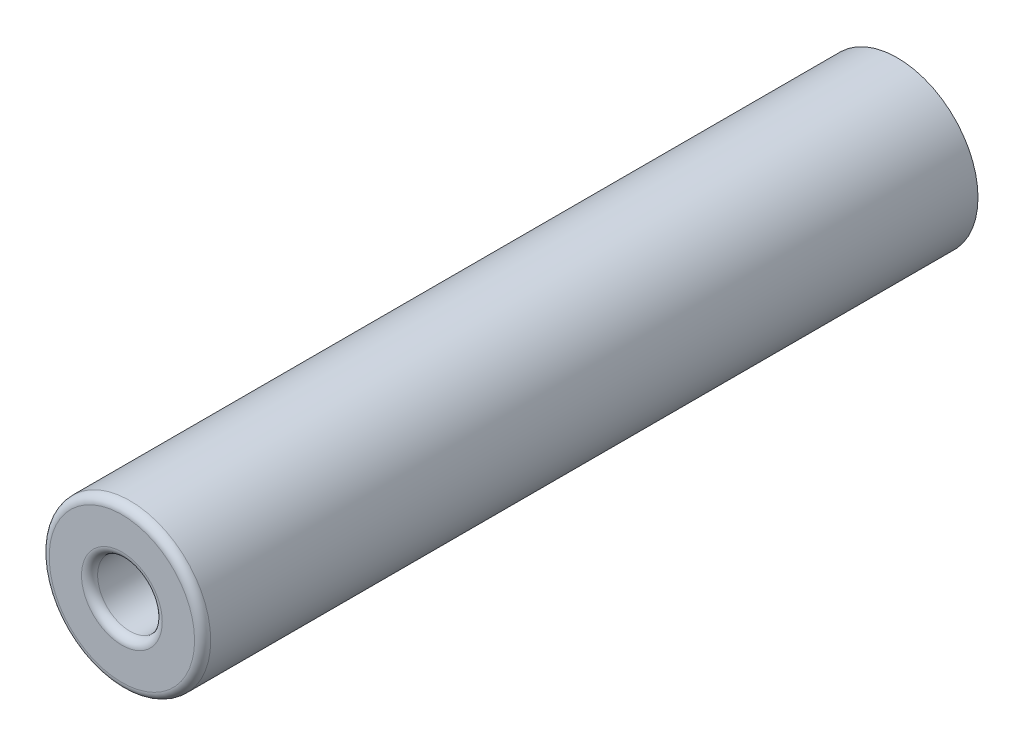
ISO-10303-21;
HEADER;
FILE_DESCRIPTION(('STEP AP214'),'2;1');
FILE_NAME('part.step','',(''),(''),'','','');
FILE_SCHEMA(('AUTOMOTIVE_DESIGN { 1 0 10303 214 1 1 1 1 }'));
ENDSEC;
DATA;
#1=APPLICATION_CONTEXT('core data for automotive mechanical design processes');
#2=APPLICATION_PROTOCOL_DEFINITION('international standard','automotive_design',2000,#1);
#3=PRODUCT_CONTEXT('',#1,'mechanical');
#4=PRODUCT('Part','Part','',(#3));
#5=PRODUCT_RELATED_PRODUCT_CATEGORY('part','',(#4));
#6=PRODUCT_DEFINITION_FORMATION('','',#4);
#7=PRODUCT_DEFINITION_CONTEXT('part definition',#1,'design');
#8=PRODUCT_DEFINITION('design','',#6,#7);
#9=PRODUCT_DEFINITION_SHAPE('','',#8);
#10=(LENGTH_UNIT() NAMED_UNIT(*) SI_UNIT(.MILLI.,.METRE.));
#11=(NAMED_UNIT(*) PLANE_ANGLE_UNIT() SI_UNIT($,.RADIAN.));
#12=(NAMED_UNIT(*) SI_UNIT($,.STERADIAN.) SOLID_ANGLE_UNIT());
#13=UNCERTAINTY_MEASURE_WITH_UNIT(LENGTH_MEASURE(1.E-05),#10,'distance_accuracy_value','');
#14=(GEOMETRIC_REPRESENTATION_CONTEXT(3) GLOBAL_UNCERTAINTY_ASSIGNED_CONTEXT((#13)) GLOBAL_UNIT_ASSIGNED_CONTEXT((#10,
#11,#12)) REPRESENTATION_CONTEXT('',''));
#15=CARTESIAN_POINT('',(0.,0.,0.));
#16=DIRECTION('',(0.,0.,1.));
#17=DIRECTION('',(1.,0.,0.));
#18=AXIS2_PLACEMENT_3D('',#15,#16,#17);
#19=CARTESIAN_POINT('',(0.,0.,24.));
#20=DIRECTION('',(0.,0.,-1.));
#21=DIRECTION('',(-1.,0.,0.));
#22=AXIS2_PLACEMENT_3D('',#19,#20,#21);
#23=CYLINDRICAL_SURFACE('',#22,2.5);
#24=CARTESIAN_POINT('',(0.,0.,23.75));
#25=DIRECTION('',(0.,0.,1.));
#26=DIRECTION('',(1.,0.,0.));
#27=AXIS2_PLACEMENT_3D('',#24,#25,#26);
#28=CIRCLE('',#27,2.5);
#29=CARTESIAN_POINT('',(2.5,0.,23.75));
#30=VERTEX_POINT('',#29);
#31=EDGE_CURVE('E38',#30,#30,#28,.F.);
#32=ORIENTED_EDGE('',*,*,#31,.T.);
#33=EDGE_LOOP('',(#32));
#34=FACE_BOUND('',#33,.T.);
#35=CARTESIAN_POINT('',(0.,0.,0.));
#36=DIRECTION('',(0.,0.,1.));
#37=DIRECTION('',(1.,0.,0.));
#38=AXIS2_PLACEMENT_3D('',#35,#36,#37);
#39=CIRCLE('',#38,2.5);
#40=CARTESIAN_POINT('',(2.5,0.,0.));
#41=VERTEX_POINT('',#40);
#42=EDGE_CURVE('E51',#41,#41,#39,.T.);
#43=ORIENTED_EDGE('',*,*,#42,.T.);
#44=EDGE_LOOP('',(#43));
#45=FACE_BOUND('',#44,.T.);
#46=ADVANCED_FACE('F31',(#34,#45),#23,.T.);
#47=CARTESIAN_POINT('',(0.,0.,24.));
#48=DIRECTION('',(0.,0.,1.));
#49=DIRECTION('',(1.,0.,0.));
#50=AXIS2_PLACEMENT_3D('',#47,#48,#49);
#51=PLANE('',#50);
#52=CARTESIAN_POINT('',(0.,0.,24.));
#53=DIRECTION('',(0.,0.,1.));
#54=DIRECTION('',(1.,0.,0.));
#55=AXIS2_PLACEMENT_3D('',#52,#53,#54);
#56=CIRCLE('',#55,2.25);
#57=CARTESIAN_POINT('',(2.25,0.,24.));
#58=VERTEX_POINT('',#57);
#59=EDGE_CURVE('E42',#58,#58,#56,.T.);
#60=ORIENTED_EDGE('',*,*,#59,.T.);
#61=EDGE_LOOP('',(#60));
#62=FACE_BOUND('',#61,.T.);
#63=CARTESIAN_POINT('',(0.,0.,24.));
#64=DIRECTION('',(0.,0.,1.));
#65=DIRECTION('',(1.,0.,0.));
#66=AXIS2_PLACEMENT_3D('',#63,#64,#65);
#67=CIRCLE('',#66,1.25);
#68=CARTESIAN_POINT('',(1.25,0.,24.));
#69=VERTEX_POINT('',#68);
#70=EDGE_CURVE('E46',#69,#69,#67,.F.);
#71=ORIENTED_EDGE('',*,*,#70,.T.);
#72=EDGE_LOOP('',(#71));
#73=FACE_BOUND('',#72,.T.);
#74=ADVANCED_FACE('F70',(#62,#73),#51,.T.);
#75=CARTESIAN_POINT('',(0.,0.,0.));
#76=DIRECTION('',(0.,0.,1.));
#77=DIRECTION('',(1.,0.,0.));
#78=AXIS2_PLACEMENT_3D('',#75,#76,#77);
#79=PLANE('',#78);
#80=ORIENTED_EDGE('',*,*,#42,.F.);
#81=EDGE_LOOP('',(#80));
#82=FACE_BOUND('',#81,.T.);
#83=ADVANCED_FACE('F62',(#82),#79,.F.);
#84=CARTESIAN_POINT('',(0.,0.,14.));
#85=DIRECTION('',(0.,0.,1.));
#86=DIRECTION('',(1.,0.,0.));
#87=AXIS2_PLACEMENT_3D('',#84,#85,#86);
#88=CYLINDRICAL_SURFACE('',#87,1.);
#89=CARTESIAN_POINT('',(0.,0.,23.75));
#90=DIRECTION('',(0.,0.,1.));
#91=DIRECTION('',(1.,0.,0.));
#92=AXIS2_PLACEMENT_3D('',#89,#90,#91);
#93=CIRCLE('',#92,1.);
#94=CARTESIAN_POINT('',(1.,0.,23.75));
#95=VERTEX_POINT('',#94);
#96=EDGE_CURVE('E10',#95,#95,#93,.T.);
#97=ORIENTED_EDGE('',*,*,#96,.T.);
#98=EDGE_LOOP('',(#97));
#99=FACE_BOUND('',#98,.T.);
#100=CARTESIAN_POINT('',(0.,0.,14.));
#101=DIRECTION('',(0.,0.,1.));
#102=DIRECTION('',(1.,0.,0.));
#103=AXIS2_PLACEMENT_3D('',#100,#101,#102);
#104=CIRCLE('',#103,1.);
#105=CARTESIAN_POINT('',(1.,0.,14.));
#106=VERTEX_POINT('',#105);
#107=EDGE_CURVE('E54',#106,#106,#104,.T.);
#108=ORIENTED_EDGE('',*,*,#107,.F.);
#109=EDGE_LOOP('',(#108));
#110=FACE_BOUND('',#109,.T.);
#111=ADVANCED_FACE('F60',(#99,#110),#88,.F.);
#112=CARTESIAN_POINT('',(0.,0.,14.));
#113=DIRECTION('',(0.,0.,1.));
#114=DIRECTION('',(1.,0.,0.));
#115=AXIS2_PLACEMENT_3D('',#112,#113,#114);
#116=PLANE('',#115);
#117=ORIENTED_EDGE('',*,*,#107,.T.);
#118=EDGE_LOOP('',(#117));
#119=FACE_BOUND('',#118,.T.);
#120=ADVANCED_FACE('F58',(#119),#116,.T.);
#121=CARTESIAN_POINT('',(0.,0.,23.75));
#122=DIRECTION('',(0.,0.,1.));
#123=DIRECTION('',(1.,0.,0.));
#124=AXIS2_PLACEMENT_3D('',#121,#122,#123);
#125=TOROIDAL_SURFACE('',#124,2.25,0.25);
#126=ORIENTED_EDGE('',*,*,#31,.F.);
#127=EDGE_LOOP('',(#126));
#128=FACE_BOUND('',#127,.T.);
#129=ORIENTED_EDGE('',*,*,#59,.F.);
#130=EDGE_LOOP('',(#129));
#131=FACE_BOUND('',#130,.T.);
#132=ADVANCED_FACE('F68',(#128,#131),#125,.T.);
#133=CARTESIAN_POINT('',(0.,0.,23.75));
#134=DIRECTION('',(0.,0.,1.));
#135=DIRECTION('',(1.,0.,0.));
#136=AXIS2_PLACEMENT_3D('',#133,#134,#135);
#137=TOROIDAL_SURFACE('',#136,1.25,0.25);
#138=ORIENTED_EDGE('',*,*,#70,.F.);
#139=EDGE_LOOP('',(#138));
#140=FACE_BOUND('',#139,.T.);
#141=ORIENTED_EDGE('',*,*,#96,.F.);
#142=EDGE_LOOP('',(#141));
#143=FACE_BOUND('',#142,.T.);
#144=ADVANCED_FACE('F33',(#140,#143),#137,.T.);
#145=CLOSED_SHELL('',(#46,#74,#83,#111,#120,#132,#144));
#146=MANIFOLD_SOLID_BREP('B2',#145);
#147=ADVANCED_BREP_SHAPE_REPRESENTATION('',(#18,#146),#14);
#148=SHAPE_DEFINITION_REPRESENTATION(#9,#147);
ENDSEC;
END-ISO-10303-21;
